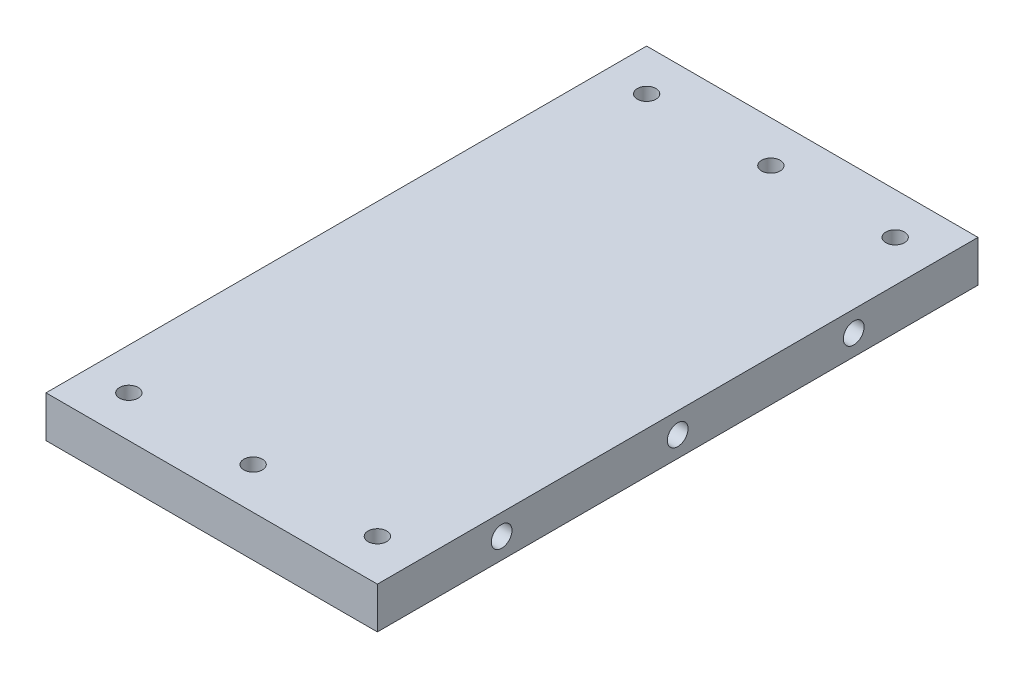
ISO-10303-21;
HEADER;
FILE_DESCRIPTION(('STEP AP214'),'2;1');
FILE_NAME('part.step','',(''),(''),'','','');
FILE_SCHEMA(('AUTOMOTIVE_DESIGN { 1 0 10303 214 1 1 1 1 }'));
ENDSEC;
DATA;
#1=APPLICATION_CONTEXT('core data for automotive mechanical design processes');
#2=APPLICATION_PROTOCOL_DEFINITION('international standard','automotive_design',2000,#1);
#3=PRODUCT_CONTEXT('',#1,'mechanical');
#4=PRODUCT('Part','Part','',(#3));
#5=PRODUCT_RELATED_PRODUCT_CATEGORY('part','',(#4));
#6=PRODUCT_DEFINITION_FORMATION('','',#4);
#7=PRODUCT_DEFINITION_CONTEXT('part definition',#1,'design');
#8=PRODUCT_DEFINITION('design','',#6,#7);
#9=PRODUCT_DEFINITION_SHAPE('','',#8);
#10=(LENGTH_UNIT() NAMED_UNIT(*) SI_UNIT(.MILLI.,.METRE.));
#11=(NAMED_UNIT(*) PLANE_ANGLE_UNIT() SI_UNIT($,.RADIAN.));
#12=(NAMED_UNIT(*) SI_UNIT($,.STERADIAN.) SOLID_ANGLE_UNIT());
#13=UNCERTAINTY_MEASURE_WITH_UNIT(LENGTH_MEASURE(1.E-05),#10,'distance_accuracy_value','');
#14=(GEOMETRIC_REPRESENTATION_CONTEXT(3) GLOBAL_UNCERTAINTY_ASSIGNED_CONTEXT((#13)) GLOBAL_UNIT_ASSIGNED_CONTEXT((#10,
#11,#12)) REPRESENTATION_CONTEXT('',''));
#15=CARTESIAN_POINT('',(0.,0.,0.));
#16=DIRECTION('',(0.,0.,1.));
#17=DIRECTION('',(1.,0.,0.));
#18=AXIS2_PLACEMENT_3D('',#15,#16,#17);
#19=CARTESIAN_POINT('',(40.,5.,72.5));
#20=DIRECTION('',(-1.,0.,0.));
#21=DIRECTION('',(0.,0.,1.));
#22=AXIS2_PLACEMENT_3D('',#19,#20,#21);
#23=PLANE('',#22);
#24=CARTESIAN_POINT('',(40.,0.,42.5));
#25=DIRECTION('',(1.,0.,0.));
#26=DIRECTION('',(0.,0.,-1.));
#27=AXIS2_PLACEMENT_3D('',#24,#25,#26);
#28=CIRCLE('',#27,2.5);
#29=CARTESIAN_POINT('',(40.,0.,40.));
#30=VERTEX_POINT('',#29);
#31=EDGE_CURVE('E125',#30,#30,#28,.T.);
#32=ORIENTED_EDGE('',*,*,#31,.F.);
#33=EDGE_LOOP('',(#32));
#34=FACE_BOUND('',#33,.T.);
#35=CARTESIAN_POINT('',(40.,0.,-42.5));
#36=DIRECTION('',(1.,0.,0.));
#37=DIRECTION('',(0.,0.,-1.));
#38=AXIS2_PLACEMENT_3D('',#35,#36,#37);
#39=CIRCLE('',#38,2.5);
#40=CARTESIAN_POINT('',(40.,0.,-45.));
#41=VERTEX_POINT('',#40);
#42=EDGE_CURVE('E119',#41,#41,#39,.T.);
#43=ORIENTED_EDGE('',*,*,#42,.F.);
#44=EDGE_LOOP('',(#43));
#45=FACE_BOUND('',#44,.T.);
#46=CARTESIAN_POINT('',(40.,0.,0.));
#47=DIRECTION('',(1.,0.,0.));
#48=DIRECTION('',(0.,0.,-1.));
#49=AXIS2_PLACEMENT_3D('',#46,#47,#48);
#50=CIRCLE('',#49,2.5);
#51=CARTESIAN_POINT('',(40.,0.,-2.5));
#52=VERTEX_POINT('',#51);
#53=EDGE_CURVE('E116',#52,#52,#50,.T.);
#54=ORIENTED_EDGE('',*,*,#53,.F.);
#55=EDGE_LOOP('',(#54));
#56=FACE_BOUND('',#55,.T.);
#57=DIRECTION('',(0.,0.,-1.));
#58=VECTOR('',#57,1.);
#59=CARTESIAN_POINT('',(40.,-5.,72.5));
#60=LINE('',#59,#58);
#61=CARTESIAN_POINT('',(40.,-5.,72.5));
#62=VERTEX_POINT('',#61);
#63=CARTESIAN_POINT('',(40.,-5.,-72.5));
#64=VERTEX_POINT('',#63);
#65=EDGE_CURVE('E102',#62,#64,#60,.T.);
#66=ORIENTED_EDGE('',*,*,#65,.T.);
#67=DIRECTION('',(0.,-1.,0.));
#68=VECTOR('',#67,1.);
#69=CARTESIAN_POINT('',(40.,5.,-72.5));
#70=LINE('',#69,#68);
#71=CARTESIAN_POINT('',(40.,5.,-72.5));
#72=VERTEX_POINT('',#71);
#73=EDGE_CURVE('E11',#72,#64,#70,.T.);
#74=ORIENTED_EDGE('',*,*,#73,.F.);
#75=DIRECTION('',(0.,0.,-1.));
#76=VECTOR('',#75,1.);
#77=CARTESIAN_POINT('',(40.,5.,72.5));
#78=LINE('',#77,#76);
#79=CARTESIAN_POINT('',(40.,5.,72.5));
#80=VERTEX_POINT('',#79);
#81=EDGE_CURVE('E90',#80,#72,#78,.T.);
#82=ORIENTED_EDGE('',*,*,#81,.F.);
#83=DIRECTION('',(0.,-1.,0.));
#84=VECTOR('',#83,1.);
#85=CARTESIAN_POINT('',(40.,5.,72.5));
#86=LINE('',#85,#84);
#87=EDGE_CURVE('E98',#80,#62,#86,.T.);
#88=ORIENTED_EDGE('',*,*,#87,.T.);
#89=EDGE_LOOP('',(#66,#74,#82,#88));
#90=FACE_BOUND('',#89,.T.);
#91=ADVANCED_FACE('F39',(#34,#45,#56,#90),#23,.F.);
#92=CARTESIAN_POINT('',(-40.,5.,-72.5));
#93=DIRECTION('',(0.,0.,1.));
#94=DIRECTION('',(1.,0.,0.));
#95=AXIS2_PLACEMENT_3D('',#92,#93,#94);
#96=PLANE('',#95);
#97=DIRECTION('',(-1.,0.,0.));
#98=VECTOR('',#97,1.);
#99=CARTESIAN_POINT('',(-40.,-5.,-72.5));
#100=LINE('',#99,#98);
#101=CARTESIAN_POINT('',(-40.,-5.,-72.5));
#102=VERTEX_POINT('',#101);
#103=EDGE_CURVE('E94',#64,#102,#100,.T.);
#104=ORIENTED_EDGE('',*,*,#103,.T.);
#105=DIRECTION('',(0.,-1.,0.));
#106=VECTOR('',#105,1.);
#107=CARTESIAN_POINT('',(-40.,5.,-72.5));
#108=LINE('',#107,#106);
#109=CARTESIAN_POINT('',(-40.,5.,-72.5));
#110=VERTEX_POINT('',#109);
#111=EDGE_CURVE('E47',#110,#102,#108,.T.);
#112=ORIENTED_EDGE('',*,*,#111,.F.);
#113=DIRECTION('',(-1.,0.,0.));
#114=VECTOR('',#113,1.);
#115=CARTESIAN_POINT('',(-40.,5.,-72.5));
#116=LINE('',#115,#114);
#117=EDGE_CURVE('E85',#72,#110,#116,.T.);
#118=ORIENTED_EDGE('',*,*,#117,.F.);
#119=ORIENTED_EDGE('',*,*,#73,.T.);
#120=EDGE_LOOP('',(#104,#112,#118,#119));
#121=FACE_BOUND('',#120,.T.);
#122=ADVANCED_FACE('F93',(#121),#96,.F.);
#123=CARTESIAN_POINT('',(-40.,5.,72.5));
#124=DIRECTION('',(1.,0.,0.));
#125=DIRECTION('',(0.,0.,-1.));
#126=AXIS2_PLACEMENT_3D('',#123,#124,#125);
#127=PLANE('',#126);
#128=CARTESIAN_POINT('',(-40.,0.,42.5));
#129=DIRECTION('',(1.,0.,0.));
#130=DIRECTION('',(0.,0.,-1.));
#131=AXIS2_PLACEMENT_3D('',#128,#129,#130);
#132=CIRCLE('',#131,2.5);
#133=CARTESIAN_POINT('',(-40.,0.,40.));
#134=VERTEX_POINT('',#133);
#135=EDGE_CURVE('E140',#134,#134,#132,.T.);
#136=ORIENTED_EDGE('',*,*,#135,.T.);
#137=EDGE_LOOP('',(#136));
#138=FACE_BOUND('',#137,.T.);
#139=CARTESIAN_POINT('',(-40.,0.,-42.5));
#140=DIRECTION('',(1.,0.,0.));
#141=DIRECTION('',(0.,0.,-1.));
#142=AXIS2_PLACEMENT_3D('',#139,#140,#141);
#143=CIRCLE('',#142,2.5);
#144=CARTESIAN_POINT('',(-40.,0.,-45.));
#145=VERTEX_POINT('',#144);
#146=EDGE_CURVE('E147',#145,#145,#143,.T.);
#147=ORIENTED_EDGE('',*,*,#146,.T.);
#148=EDGE_LOOP('',(#147));
#149=FACE_BOUND('',#148,.T.);
#150=CARTESIAN_POINT('',(-40.,0.,0.));
#151=DIRECTION('',(1.,0.,0.));
#152=DIRECTION('',(0.,0.,-1.));
#153=AXIS2_PLACEMENT_3D('',#150,#151,#152);
#154=CIRCLE('',#153,2.5);
#155=CARTESIAN_POINT('',(-40.,0.,-2.5));
#156=VERTEX_POINT('',#155);
#157=EDGE_CURVE('E134',#156,#156,#154,.T.);
#158=ORIENTED_EDGE('',*,*,#157,.T.);
#159=EDGE_LOOP('',(#158));
#160=FACE_BOUND('',#159,.T.);
#161=DIRECTION('',(0.,0.,1.));
#162=VECTOR('',#161,1.);
#163=CARTESIAN_POINT('',(-40.,-5.,72.5));
#164=LINE('',#163,#162);
#165=CARTESIAN_POINT('',(-40.,-5.,72.5));
#166=VERTEX_POINT('',#165);
#167=EDGE_CURVE('E72',#102,#166,#164,.T.);
#168=ORIENTED_EDGE('',*,*,#167,.T.);
#169=DIRECTION('',(0.,-1.,0.));
#170=VECTOR('',#169,1.);
#171=CARTESIAN_POINT('',(-40.,5.,72.5));
#172=LINE('',#171,#170);
#173=CARTESIAN_POINT('',(-40.,5.,72.5));
#174=VERTEX_POINT('',#173);
#175=EDGE_CURVE('E95',#174,#166,#172,.T.);
#176=ORIENTED_EDGE('',*,*,#175,.F.);
#177=DIRECTION('',(0.,0.,1.));
#178=VECTOR('',#177,1.);
#179=CARTESIAN_POINT('',(-40.,5.,72.5));
#180=LINE('',#179,#178);
#181=EDGE_CURVE('E88',#110,#174,#180,.T.);
#182=ORIENTED_EDGE('',*,*,#181,.F.);
#183=ORIENTED_EDGE('',*,*,#111,.T.);
#184=EDGE_LOOP('',(#168,#176,#182,#183));
#185=FACE_BOUND('',#184,.T.);
#186=ADVANCED_FACE('F96',(#138,#149,#160,#185),#127,.F.);
#187=CARTESIAN_POINT('',(-40.,5.,72.5));
#188=DIRECTION('',(0.,0.,-1.));
#189=DIRECTION('',(-1.,0.,0.));
#190=AXIS2_PLACEMENT_3D('',#187,#188,#189);
#191=PLANE('',#190);
#192=DIRECTION('',(1.,0.,0.));
#193=VECTOR('',#192,1.);
#194=CARTESIAN_POINT('',(-40.,-5.,72.5));
#195=LINE('',#194,#193);
#196=EDGE_CURVE('E78',#166,#62,#195,.T.);
#197=ORIENTED_EDGE('',*,*,#196,.T.);
#198=ORIENTED_EDGE('',*,*,#87,.F.);
#199=DIRECTION('',(1.,0.,0.));
#200=VECTOR('',#199,1.);
#201=CARTESIAN_POINT('',(-40.,5.,72.5));
#202=LINE('',#201,#200);
#203=EDGE_CURVE('E55',#174,#80,#202,.T.);
#204=ORIENTED_EDGE('',*,*,#203,.F.);
#205=ORIENTED_EDGE('',*,*,#175,.T.);
#206=EDGE_LOOP('',(#197,#198,#204,#205));
#207=FACE_BOUND('',#206,.T.);
#208=ADVANCED_FACE('F110',(#207),#191,.F.);
#209=CARTESIAN_POINT('',(0.,5.,0.));
#210=DIRECTION('',(0.,-1.,0.));
#211=DIRECTION('',(0.,0.,-1.));
#212=AXIS2_PLACEMENT_3D('',#209,#210,#211);
#213=PLANE('',#212);
#214=CARTESIAN_POINT('',(-30.,5.,-62.5));
#215=DIRECTION('',(0.,-1.,0.));
#216=DIRECTION('',(0.,0.,1.));
#217=AXIS2_PLACEMENT_3D('',#214,#215,#216);
#218=CIRCLE('',#217,2.25);
#219=CARTESIAN_POINT('',(-30.,5.,-60.25));
#220=VERTEX_POINT('',#219);
#221=EDGE_CURVE('E158',#220,#220,#218,.T.);
#222=ORIENTED_EDGE('',*,*,#221,.T.);
#223=EDGE_LOOP('',(#222));
#224=FACE_BOUND('',#223,.T.);
#225=CARTESIAN_POINT('',(0.,5.,-62.5));
#226=DIRECTION('',(0.,-1.,0.));
#227=DIRECTION('',(0.,0.,1.));
#228=AXIS2_PLACEMENT_3D('',#225,#226,#227);
#229=CIRCLE('',#228,2.25);
#230=CARTESIAN_POINT('',(0.,5.,-60.25));
#231=VERTEX_POINT('',#230);
#232=EDGE_CURVE('E164',#231,#231,#229,.T.);
#233=ORIENTED_EDGE('',*,*,#232,.T.);
#234=EDGE_LOOP('',(#233));
#235=FACE_BOUND('',#234,.T.);
#236=CARTESIAN_POINT('',(30.,5.,-62.5));
#237=DIRECTION('',(0.,-1.,0.));
#238=DIRECTION('',(0.,0.,1.));
#239=AXIS2_PLACEMENT_3D('',#236,#237,#238);
#240=CIRCLE('',#239,2.25);
#241=CARTESIAN_POINT('',(30.,5.,-60.25));
#242=VERTEX_POINT('',#241);
#243=EDGE_CURVE('E170',#242,#242,#240,.T.);
#244=ORIENTED_EDGE('',*,*,#243,.T.);
#245=EDGE_LOOP('',(#244));
#246=FACE_BOUND('',#245,.T.);
#247=CARTESIAN_POINT('',(30.,5.,62.5));
#248=DIRECTION('',(0.,-1.,0.));
#249=DIRECTION('',(0.,0.,-1.));
#250=AXIS2_PLACEMENT_3D('',#247,#248,#249);
#251=CIRCLE('',#250,2.25);
#252=CARTESIAN_POINT('',(30.,5.,60.25));
#253=VERTEX_POINT('',#252);
#254=EDGE_CURVE('E176',#253,#253,#251,.T.);
#255=ORIENTED_EDGE('',*,*,#254,.T.);
#256=EDGE_LOOP('',(#255));
#257=FACE_BOUND('',#256,.T.);
#258=CARTESIAN_POINT('',(0.,5.,62.5));
#259=DIRECTION('',(0.,-1.,0.));
#260=DIRECTION('',(0.,0.,-1.));
#261=AXIS2_PLACEMENT_3D('',#258,#259,#260);
#262=CIRCLE('',#261,2.25);
#263=CARTESIAN_POINT('',(0.,5.,60.25));
#264=VERTEX_POINT('',#263);
#265=EDGE_CURVE('E182',#264,#264,#262,.T.);
#266=ORIENTED_EDGE('',*,*,#265,.T.);
#267=EDGE_LOOP('',(#266));
#268=FACE_BOUND('',#267,.T.);
#269=CARTESIAN_POINT('',(-30.,5.,62.5));
#270=DIRECTION('',(0.,-1.,0.));
#271=DIRECTION('',(0.,0.,-1.));
#272=AXIS2_PLACEMENT_3D('',#269,#270,#271);
#273=CIRCLE('',#272,2.25);
#274=CARTESIAN_POINT('',(-30.,5.,60.25));
#275=VERTEX_POINT('',#274);
#276=EDGE_CURVE('E144',#275,#275,#273,.T.);
#277=ORIENTED_EDGE('',*,*,#276,.T.);
#278=EDGE_LOOP('',(#277));
#279=FACE_BOUND('',#278,.T.);
#280=ORIENTED_EDGE('',*,*,#81,.T.);
#281=ORIENTED_EDGE('',*,*,#117,.T.);
#282=ORIENTED_EDGE('',*,*,#181,.T.);
#283=ORIENTED_EDGE('',*,*,#203,.T.);
#284=EDGE_LOOP('',(#280,#281,#282,#283));
#285=FACE_BOUND('',#284,.T.);
#286=ADVANCED_FACE('F86',(#224,#235,#246,#257,#268,#279,#285),#213,.F.);
#287=CARTESIAN_POINT('',(0.,-5.,0.));
#288=DIRECTION('',(0.,-1.,0.));
#289=DIRECTION('',(0.,0.,-1.));
#290=AXIS2_PLACEMENT_3D('',#287,#288,#289);
#291=PLANE('',#290);
#292=CARTESIAN_POINT('',(-30.,-5.,-62.5));
#293=DIRECTION('',(0.,-1.,0.));
#294=DIRECTION('',(0.,0.,1.));
#295=AXIS2_PLACEMENT_3D('',#292,#293,#294);
#296=CIRCLE('',#295,2.25);
#297=CARTESIAN_POINT('',(-30.,-5.,-60.25));
#298=VERTEX_POINT('',#297);
#299=EDGE_CURVE('E161',#298,#298,#296,.T.);
#300=ORIENTED_EDGE('',*,*,#299,.F.);
#301=EDGE_LOOP('',(#300));
#302=FACE_BOUND('',#301,.T.);
#303=CARTESIAN_POINT('',(0.,-5.,-62.5));
#304=DIRECTION('',(0.,-1.,0.));
#305=DIRECTION('',(0.,0.,1.));
#306=AXIS2_PLACEMENT_3D('',#303,#304,#305);
#307=CIRCLE('',#306,2.25);
#308=CARTESIAN_POINT('',(0.,-5.,-60.25));
#309=VERTEX_POINT('',#308);
#310=EDGE_CURVE('E167',#309,#309,#307,.T.);
#311=ORIENTED_EDGE('',*,*,#310,.F.);
#312=EDGE_LOOP('',(#311));
#313=FACE_BOUND('',#312,.T.);
#314=CARTESIAN_POINT('',(30.,-5.,-62.5));
#315=DIRECTION('',(0.,-1.,0.));
#316=DIRECTION('',(0.,0.,1.));
#317=AXIS2_PLACEMENT_3D('',#314,#315,#316);
#318=CIRCLE('',#317,2.25);
#319=CARTESIAN_POINT('',(30.,-5.,-60.25));
#320=VERTEX_POINT('',#319);
#321=EDGE_CURVE('E173',#320,#320,#318,.T.);
#322=ORIENTED_EDGE('',*,*,#321,.F.);
#323=EDGE_LOOP('',(#322));
#324=FACE_BOUND('',#323,.T.);
#325=CARTESIAN_POINT('',(30.,-5.,62.5));
#326=DIRECTION('',(0.,-1.,0.));
#327=DIRECTION('',(0.,0.,-1.));
#328=AXIS2_PLACEMENT_3D('',#325,#326,#327);
#329=CIRCLE('',#328,2.25);
#330=CARTESIAN_POINT('',(30.,-5.,60.25));
#331=VERTEX_POINT('',#330);
#332=EDGE_CURVE('E179',#331,#331,#329,.T.);
#333=ORIENTED_EDGE('',*,*,#332,.F.);
#334=EDGE_LOOP('',(#333));
#335=FACE_BOUND('',#334,.T.);
#336=CARTESIAN_POINT('',(0.,-5.,62.5));
#337=DIRECTION('',(0.,-1.,0.));
#338=DIRECTION('',(0.,0.,-1.));
#339=AXIS2_PLACEMENT_3D('',#336,#337,#338);
#340=CIRCLE('',#339,2.25);
#341=CARTESIAN_POINT('',(0.,-5.,60.25));
#342=VERTEX_POINT('',#341);
#343=EDGE_CURVE('E155',#342,#342,#340,.T.);
#344=ORIENTED_EDGE('',*,*,#343,.F.);
#345=EDGE_LOOP('',(#344));
#346=FACE_BOUND('',#345,.T.);
#347=CARTESIAN_POINT('',(-30.,-5.,62.5));
#348=DIRECTION('',(0.,-1.,0.));
#349=DIRECTION('',(0.,0.,-1.));
#350=AXIS2_PLACEMENT_3D('',#347,#348,#349);
#351=CIRCLE('',#350,2.25);
#352=CARTESIAN_POINT('',(-30.,-5.,60.25));
#353=VERTEX_POINT('',#352);
#354=EDGE_CURVE('E152',#353,#353,#351,.T.);
#355=ORIENTED_EDGE('',*,*,#354,.F.);
#356=EDGE_LOOP('',(#355));
#357=FACE_BOUND('',#356,.T.);
#358=ORIENTED_EDGE('',*,*,#65,.F.);
#359=ORIENTED_EDGE('',*,*,#196,.F.);
#360=ORIENTED_EDGE('',*,*,#167,.F.);
#361=ORIENTED_EDGE('',*,*,#103,.F.);
#362=EDGE_LOOP('',(#358,#359,#360,#361));
#363=FACE_BOUND('',#362,.T.);
#364=ADVANCED_FACE('F113',(#302,#313,#324,#335,#346,#357,#363),#291,.T.);
#365=CARTESIAN_POINT('',(30.,0.,0.));
#366=DIRECTION('',(1.,0.,0.));
#367=DIRECTION('',(0.,0.,-1.));
#368=AXIS2_PLACEMENT_3D('',#365,#366,#367);
#369=CYLINDRICAL_SURFACE('',#368,2.5);
#370=CARTESIAN_POINT('',(30.,0.,0.));
#371=DIRECTION('',(1.,0.,0.));
#372=DIRECTION('',(0.,0.,-1.));
#373=AXIS2_PLACEMENT_3D('',#370,#371,#372);
#374=CIRCLE('',#373,2.5);
#375=CARTESIAN_POINT('',(30.,0.,-2.5));
#376=VERTEX_POINT('',#375);
#377=EDGE_CURVE('E105',#376,#376,#374,.T.);
#378=ORIENTED_EDGE('',*,*,#377,.F.);
#379=EDGE_LOOP('',(#378));
#380=FACE_BOUND('',#379,.T.);
#381=ORIENTED_EDGE('',*,*,#53,.T.);
#382=EDGE_LOOP('',(#381));
#383=FACE_BOUND('',#382,.T.);
#384=ADVANCED_FACE('F192',(#380,#383),#369,.F.);
#385=CARTESIAN_POINT('',(30.,0.,0.));
#386=DIRECTION('',(1.,0.,0.));
#387=DIRECTION('',(0.,0.,-1.));
#388=AXIS2_PLACEMENT_3D('',#385,#386,#387);
#389=PLANE('',#388);
#390=ORIENTED_EDGE('',*,*,#377,.T.);
#391=EDGE_LOOP('',(#390));
#392=FACE_BOUND('',#391,.T.);
#393=ADVANCED_FACE('F228',(#392),#389,.T.);
#394=CARTESIAN_POINT('',(30.,0.,-42.5));
#395=DIRECTION('',(1.,0.,0.));
#396=DIRECTION('',(0.,0.,-1.));
#397=AXIS2_PLACEMENT_3D('',#394,#395,#396);
#398=CYLINDRICAL_SURFACE('',#397,2.5);
#399=CARTESIAN_POINT('',(30.,0.,-42.5));
#400=DIRECTION('',(1.,0.,0.));
#401=DIRECTION('',(0.,0.,-1.));
#402=AXIS2_PLACEMENT_3D('',#399,#400,#401);
#403=CIRCLE('',#402,2.5);
#404=CARTESIAN_POINT('',(30.,0.,-45.));
#405=VERTEX_POINT('',#404);
#406=EDGE_CURVE('E129',#405,#405,#403,.T.);
#407=ORIENTED_EDGE('',*,*,#406,.F.);
#408=EDGE_LOOP('',(#407));
#409=FACE_BOUND('',#408,.T.);
#410=ORIENTED_EDGE('',*,*,#42,.T.);
#411=EDGE_LOOP('',(#410));
#412=FACE_BOUND('',#411,.T.);
#413=ADVANCED_FACE('F234',(#409,#412),#398,.F.);
#414=CARTESIAN_POINT('',(30.,0.,-42.5));
#415=DIRECTION('',(1.,0.,0.));
#416=DIRECTION('',(0.,0.,-1.));
#417=AXIS2_PLACEMENT_3D('',#414,#415,#416);
#418=PLANE('',#417);
#419=ORIENTED_EDGE('',*,*,#406,.T.);
#420=EDGE_LOOP('',(#419));
#421=FACE_BOUND('',#420,.T.);
#422=ADVANCED_FACE('F273',(#421),#418,.T.);
#423=CARTESIAN_POINT('',(30.,0.,42.5));
#424=DIRECTION('',(1.,0.,0.));
#425=DIRECTION('',(0.,0.,-1.));
#426=AXIS2_PLACEMENT_3D('',#423,#424,#425);
#427=CYLINDRICAL_SURFACE('',#426,2.5);
#428=CARTESIAN_POINT('',(30.,0.,42.5));
#429=DIRECTION('',(1.,0.,0.));
#430=DIRECTION('',(0.,0.,-1.));
#431=AXIS2_PLACEMENT_3D('',#428,#429,#430);
#432=CIRCLE('',#431,2.5);
#433=CARTESIAN_POINT('',(30.,0.,40.));
#434=VERTEX_POINT('',#433);
#435=EDGE_CURVE('E122',#434,#434,#432,.T.);
#436=ORIENTED_EDGE('',*,*,#435,.F.);
#437=EDGE_LOOP('',(#436));
#438=FACE_BOUND('',#437,.T.);
#439=ORIENTED_EDGE('',*,*,#31,.T.);
#440=EDGE_LOOP('',(#439));
#441=FACE_BOUND('',#440,.T.);
#442=ADVANCED_FACE('F267',(#438,#441),#427,.F.);
#443=CARTESIAN_POINT('',(30.,0.,42.5));
#444=DIRECTION('',(1.,0.,0.));
#445=DIRECTION('',(0.,0.,-1.));
#446=AXIS2_PLACEMENT_3D('',#443,#444,#445);
#447=PLANE('',#446);
#448=ORIENTED_EDGE('',*,*,#435,.T.);
#449=EDGE_LOOP('',(#448));
#450=FACE_BOUND('',#449,.T.);
#451=ADVANCED_FACE('F258',(#450),#447,.T.);
#452=CARTESIAN_POINT('',(-30.,0.,0.));
#453=DIRECTION('',(-1.,0.,0.));
#454=DIRECTION('',(0.,0.,1.));
#455=AXIS2_PLACEMENT_3D('',#452,#453,#454);
#456=CYLINDRICAL_SURFACE('',#455,2.5);
#457=CARTESIAN_POINT('',(-30.,0.,0.));
#458=DIRECTION('',(1.,0.,0.));
#459=DIRECTION('',(0.,0.,-1.));
#460=AXIS2_PLACEMENT_3D('',#457,#458,#459);
#461=CIRCLE('',#460,2.5);
#462=CARTESIAN_POINT('',(-30.,0.,-2.5));
#463=VERTEX_POINT('',#462);
#464=EDGE_CURVE('E126',#463,#463,#461,.T.);
#465=ORIENTED_EDGE('',*,*,#464,.T.);
#466=EDGE_LOOP('',(#465));
#467=FACE_BOUND('',#466,.T.);
#468=ORIENTED_EDGE('',*,*,#157,.F.);
#469=EDGE_LOOP('',(#468));
#470=FACE_BOUND('',#469,.T.);
#471=ADVANCED_FACE('F256',(#467,#470),#456,.F.);
#472=CARTESIAN_POINT('',(-30.,0.,0.));
#473=DIRECTION('',(-1.,0.,0.));
#474=DIRECTION('',(0.,0.,-1.));
#475=AXIS2_PLACEMENT_3D('',#472,#473,#474);
#476=PLANE('',#475);
#477=ORIENTED_EDGE('',*,*,#464,.F.);
#478=EDGE_LOOP('',(#477));
#479=FACE_BOUND('',#478,.T.);
#480=ADVANCED_FACE('F257',(#479),#476,.T.);
#481=CARTESIAN_POINT('',(-30.,0.,-42.5));
#482=DIRECTION('',(-1.,0.,0.));
#483=DIRECTION('',(0.,0.,1.));
#484=AXIS2_PLACEMENT_3D('',#481,#482,#483);
#485=CYLINDRICAL_SURFACE('',#484,2.5);
#486=CARTESIAN_POINT('',(-30.,0.,-42.5));
#487=DIRECTION('',(1.,0.,0.));
#488=DIRECTION('',(0.,0.,-1.));
#489=AXIS2_PLACEMENT_3D('',#486,#487,#488);
#490=CIRCLE('',#489,2.5);
#491=CARTESIAN_POINT('',(-30.,0.,-45.));
#492=VERTEX_POINT('',#491);
#493=EDGE_CURVE('E137',#492,#492,#490,.T.);
#494=ORIENTED_EDGE('',*,*,#493,.T.);
#495=EDGE_LOOP('',(#494));
#496=FACE_BOUND('',#495,.T.);
#497=ORIENTED_EDGE('',*,*,#146,.F.);
#498=EDGE_LOOP('',(#497));
#499=FACE_BOUND('',#498,.T.);
#500=ADVANCED_FACE('F264',(#496,#499),#485,.F.);
#501=CARTESIAN_POINT('',(-30.,0.,-42.5));
#502=DIRECTION('',(-1.,0.,0.));
#503=DIRECTION('',(0.,0.,-1.));
#504=AXIS2_PLACEMENT_3D('',#501,#502,#503);
#505=PLANE('',#504);
#506=ORIENTED_EDGE('',*,*,#493,.F.);
#507=EDGE_LOOP('',(#506));
#508=FACE_BOUND('',#507,.T.);
#509=ADVANCED_FACE('F311',(#508),#505,.T.);
#510=CARTESIAN_POINT('',(-30.,0.,42.5));
#511=DIRECTION('',(-1.,0.,0.));
#512=DIRECTION('',(0.,0.,1.));
#513=AXIS2_PLACEMENT_3D('',#510,#511,#512);
#514=CYLINDRICAL_SURFACE('',#513,2.5);
#515=CARTESIAN_POINT('',(-30.,0.,42.5));
#516=DIRECTION('',(1.,0.,0.));
#517=DIRECTION('',(0.,0.,-1.));
#518=AXIS2_PLACEMENT_3D('',#515,#516,#517);
#519=CIRCLE('',#518,2.5);
#520=CARTESIAN_POINT('',(-30.,0.,40.));
#521=VERTEX_POINT('',#520);
#522=EDGE_CURVE('E143',#521,#521,#519,.T.);
#523=ORIENTED_EDGE('',*,*,#522,.T.);
#524=EDGE_LOOP('',(#523));
#525=FACE_BOUND('',#524,.T.);
#526=ORIENTED_EDGE('',*,*,#135,.F.);
#527=EDGE_LOOP('',(#526));
#528=FACE_BOUND('',#527,.T.);
#529=ADVANCED_FACE('F209',(#525,#528),#514,.F.);
#530=CARTESIAN_POINT('',(-30.,0.,42.5));
#531=DIRECTION('',(-1.,0.,0.));
#532=DIRECTION('',(0.,0.,-1.));
#533=AXIS2_PLACEMENT_3D('',#530,#531,#532);
#534=PLANE('',#533);
#535=ORIENTED_EDGE('',*,*,#522,.F.);
#536=EDGE_LOOP('',(#535));
#537=FACE_BOUND('',#536,.T.);
#538=ADVANCED_FACE('F199',(#537),#534,.T.);
#539=CARTESIAN_POINT('',(-30.,5.,62.5));
#540=DIRECTION('',(0.,-1.,0.));
#541=DIRECTION('',(0.,0.,-1.));
#542=AXIS2_PLACEMENT_3D('',#539,#540,#541);
#543=CYLINDRICAL_SURFACE('',#542,2.25);
#544=ORIENTED_EDGE('',*,*,#276,.F.);
#545=EDGE_LOOP('',(#544));
#546=FACE_BOUND('',#545,.T.);
#547=ORIENTED_EDGE('',*,*,#354,.T.);
#548=EDGE_LOOP('',(#547));
#549=FACE_BOUND('',#548,.T.);
#550=ADVANCED_FACE('F197',(#546,#549),#543,.F.);
#551=CARTESIAN_POINT('',(0.,5.,62.5));
#552=DIRECTION('',(0.,-1.,0.));
#553=DIRECTION('',(0.,0.,-1.));
#554=AXIS2_PLACEMENT_3D('',#551,#552,#553);
#555=CYLINDRICAL_SURFACE('',#554,2.25);
#556=ORIENTED_EDGE('',*,*,#265,.F.);
#557=EDGE_LOOP('',(#556));
#558=FACE_BOUND('',#557,.T.);
#559=ORIENTED_EDGE('',*,*,#343,.T.);
#560=EDGE_LOOP('',(#559));
#561=FACE_BOUND('',#560,.T.);
#562=ADVANCED_FACE('F188',(#558,#561),#555,.F.);
#563=CARTESIAN_POINT('',(30.,5.,62.5));
#564=DIRECTION('',(0.,-1.,0.));
#565=DIRECTION('',(0.,0.,-1.));
#566=AXIS2_PLACEMENT_3D('',#563,#564,#565);
#567=CYLINDRICAL_SURFACE('',#566,2.25);
#568=ORIENTED_EDGE('',*,*,#254,.F.);
#569=EDGE_LOOP('',(#568));
#570=FACE_BOUND('',#569,.T.);
#571=ORIENTED_EDGE('',*,*,#332,.T.);
#572=EDGE_LOOP('',(#571));
#573=FACE_BOUND('',#572,.T.);
#574=ADVANCED_FACE('F205',(#570,#573),#567,.F.);
#575=CARTESIAN_POINT('',(30.,5.,-62.5));
#576=DIRECTION('',(0.,-1.,0.));
#577=DIRECTION('',(0.,0.,-1.));
#578=AXIS2_PLACEMENT_3D('',#575,#576,#577);
#579=CYLINDRICAL_SURFACE('',#578,2.25);
#580=ORIENTED_EDGE('',*,*,#243,.F.);
#581=EDGE_LOOP('',(#580));
#582=FACE_BOUND('',#581,.T.);
#583=ORIENTED_EDGE('',*,*,#321,.T.);
#584=EDGE_LOOP('',(#583));
#585=FACE_BOUND('',#584,.T.);
#586=ADVANCED_FACE('F353',(#582,#585),#579,.F.);
#587=CARTESIAN_POINT('',(0.,5.,-62.5));
#588=DIRECTION('',(0.,-1.,0.));
#589=DIRECTION('',(0.,0.,-1.));
#590=AXIS2_PLACEMENT_3D('',#587,#588,#589);
#591=CYLINDRICAL_SURFACE('',#590,2.25);
#592=ORIENTED_EDGE('',*,*,#232,.F.);
#593=EDGE_LOOP('',(#592));
#594=FACE_BOUND('',#593,.T.);
#595=ORIENTED_EDGE('',*,*,#310,.T.);
#596=EDGE_LOOP('',(#595));
#597=FACE_BOUND('',#596,.T.);
#598=ADVANCED_FACE('F363',(#594,#597),#591,.F.);
#599=CARTESIAN_POINT('',(-30.,5.,-62.5));
#600=DIRECTION('',(0.,-1.,0.));
#601=DIRECTION('',(0.,0.,-1.));
#602=AXIS2_PLACEMENT_3D('',#599,#600,#601);
#603=CYLINDRICAL_SURFACE('',#602,2.25);
#604=ORIENTED_EDGE('',*,*,#221,.F.);
#605=EDGE_LOOP('',(#604));
#606=FACE_BOUND('',#605,.T.);
#607=ORIENTED_EDGE('',*,*,#299,.T.);
#608=EDGE_LOOP('',(#607));
#609=FACE_BOUND('',#608,.T.);
#610=ADVANCED_FACE('F373',(#606,#609),#603,.F.);
#611=CLOSED_SHELL('',(#91,#122,#186,#208,#286,#364,#384,#393,#413,#422,#442,#451,#471,#480,#500,
#509,#529,#538,#550,#562,#574,#586,#598,#610));
#612=MANIFOLD_SOLID_BREP('B2',#611);
#613=ADVANCED_BREP_SHAPE_REPRESENTATION('',(#18,#612),#14);
#614=SHAPE_DEFINITION_REPRESENTATION(#9,#613);
ENDSEC;
END-ISO-10303-21;
